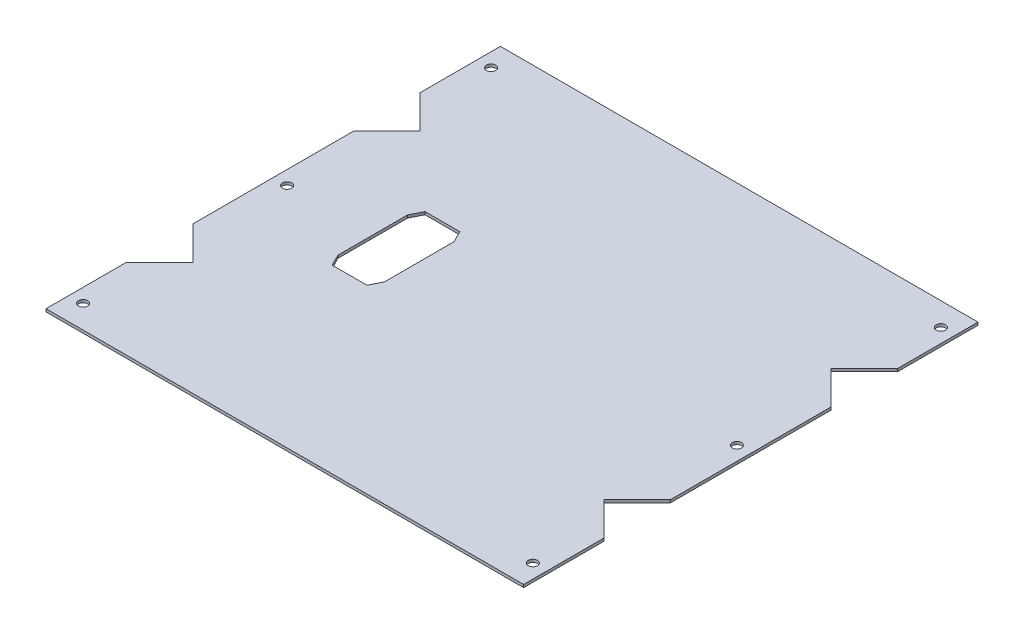
ISO-10303-21;
HEADER;
FILE_DESCRIPTION(('STEP AP214'),'2;1');
FILE_NAME('part.step','',(''),(''),'','','');
FILE_SCHEMA(('AUTOMOTIVE_DESIGN { 1 0 10303 214 1 1 1 1 }'));
ENDSEC;
DATA;
#1=APPLICATION_CONTEXT('core data for automotive mechanical design processes');
#2=APPLICATION_PROTOCOL_DEFINITION('international standard','automotive_design',2000,#1);
#3=PRODUCT_CONTEXT('',#1,'mechanical');
#4=PRODUCT('Part','Part','',(#3));
#5=PRODUCT_RELATED_PRODUCT_CATEGORY('part','',(#4));
#6=PRODUCT_DEFINITION_FORMATION('','',#4);
#7=PRODUCT_DEFINITION_CONTEXT('part definition',#1,'design');
#8=PRODUCT_DEFINITION('design','',#6,#7);
#9=PRODUCT_DEFINITION_SHAPE('','',#8);
#10=(LENGTH_UNIT() NAMED_UNIT(*) SI_UNIT(.MILLI.,.METRE.));
#11=(NAMED_UNIT(*) PLANE_ANGLE_UNIT() SI_UNIT($,.RADIAN.));
#12=(NAMED_UNIT(*) SI_UNIT($,.STERADIAN.) SOLID_ANGLE_UNIT());
#13=UNCERTAINTY_MEASURE_WITH_UNIT(LENGTH_MEASURE(1.E-05),#10,'distance_accuracy_value','');
#14=(GEOMETRIC_REPRESENTATION_CONTEXT(3) GLOBAL_UNCERTAINTY_ASSIGNED_CONTEXT((#13)) GLOBAL_UNIT_ASSIGNED_CONTEXT((#10,
#11,#12)) REPRESENTATION_CONTEXT('',''));
#15=CARTESIAN_POINT('',(0.,0.,0.));
#16=DIRECTION('',(0.,0.,1.));
#17=DIRECTION('',(1.,0.,0.));
#18=AXIS2_PLACEMENT_3D('',#15,#16,#17);
#19=CARTESIAN_POINT('',(0.,-1.2,0.));
#20=DIRECTION('',(0.,-1.,0.));
#21=DIRECTION('',(0.,0.,-1.));
#22=AXIS2_PLACEMENT_3D('',#19,#20,#21);
#23=PLANE('',#22);
#24=DIRECTION('',(0.707106781186546,0.,-0.707106781186549));
#25=VECTOR('',#24,1.);
#26=CARTESIAN_POINT('',(90.1247785636565,-1.20000000000003,47.4464466094067));
#27=LINE('',#26,#25);
#28=CARTESIAN_POINT('',(88.608835891235,-1.20000000000002,48.9623892818282));
#29=VERTEX_POINT('',#28);
#30=CARTESIAN_POINT('',(102.924778563656,-1.20000000000012,34.6464466094067));
#31=VERTEX_POINT('',#30);
#32=EDGE_CURVE('E827',#29,#31,#27,.T.);
#33=ORIENTED_EDGE('',*,*,#32,.F.);
#34=DIRECTION('',(-0.707106781186546,0.,-0.707106781186549));
#35=VECTOR('',#34,1.);
#36=CARTESIAN_POINT('',(124.884275797213,-1.20000000000044,85.2378291878067));
#37=LINE('',#36,#35);
#38=CARTESIAN_POINT('',(102.924778563656,-1.20000000000017,63.2783319542498));
#39=VERTEX_POINT('',#38);
#40=EDGE_CURVE('E740',#39,#29,#37,.T.);
#41=ORIENTED_EDGE('',*,*,#40,.F.);
#42=DIRECTION('',(0.,0.,1.));
#43=VECTOR('',#42,1.);
#44=CARTESIAN_POINT('',(102.924778563656,-1.2000000000004,97.9247785636565));
#45=LINE('',#44,#43);
#46=CARTESIAN_POINT('',(102.924778563656,-1.2000000000004,97.9247785636565));
#47=VERTEX_POINT('',#46);
#48=EDGE_CURVE('E756',#47,#39,#45,.F.);
#49=ORIENTED_EDGE('',*,*,#48,.F.);
#50=DIRECTION('',(-1.,0.,0.));
#51=VECTOR('',#50,1.);
#52=CARTESIAN_POINT('',(89.1247785636564,-1.20000000000031,97.9247785636565));
#53=LINE('',#52,#51);
#54=CARTESIAN_POINT('',(-102.924778563656,-1.2000000000004,97.9247785636565));
#55=VERTEX_POINT('',#54);
#56=EDGE_CURVE('E778',#55,#47,#53,.F.);
#57=ORIENTED_EDGE('',*,*,#56,.F.);
#58=DIRECTION('',(0.,0.,-1.));
#59=VECTOR('',#58,1.);
#60=CARTESIAN_POINT('',(-102.924778563656,-1.20000000000007,50.1247785636566));
#61=LINE('',#60,#59);
#62=CARTESIAN_POINT('',(-102.924778563656,-1.20000000000017,63.2783319542498));
#63=VERTEX_POINT('',#62);
#64=EDGE_CURVE('E769',#63,#55,#61,.F.);
#65=ORIENTED_EDGE('',*,*,#64,.F.);
#66=DIRECTION('',(-0.707106781186546,0.,0.707106781186549));
#67=VECTOR('',#66,1.);
#68=CARTESIAN_POINT('',(-90.1247785636564,-1.2,50.4783319542498));
#69=LINE('',#68,#67);
#70=CARTESIAN_POINT('',(-88.6088358912349,-1.19999999999998,48.9623892818283));
#71=VERTEX_POINT('',#70);
#72=EDGE_CURVE('E744',#71,#63,#69,.T.);
#73=ORIENTED_EDGE('',*,*,#72,.F.);
#74=DIRECTION('',(0.707106781186546,0.,0.707106781186549));
#75=VECTOR('',#74,1.);
#76=CARTESIAN_POINT('',(-157.837189477156,-1.20000000000045,-20.2659643040926));
#77=LINE('',#76,#75);
#78=CARTESIAN_POINT('',(-102.924778563656,-1.20000000000009,34.6464466094067));
#79=VERTEX_POINT('',#78);
#80=EDGE_CURVE('E860',#79,#71,#77,.T.);
#81=ORIENTED_EDGE('',*,*,#80,.F.);
#82=DIRECTION('',(0.,0.,-1.));
#83=VECTOR('',#82,1.);
#84=CARTESIAN_POINT('',(-102.924778563656,-1.2000000000001,-47.8));
#85=LINE('',#84,#83);
#86=CARTESIAN_POINT('',(-102.924778563656,-1.2000000000001,-34.6464466094066));
#87=VERTEX_POINT('',#86);
#88=EDGE_CURVE('E829',#87,#79,#85,.F.);
#89=ORIENTED_EDGE('',*,*,#88,.F.);
#90=DIRECTION('',(-0.707106781186545,0.,0.70710678118655));
#91=VECTOR('',#90,1.);
#92=CARTESIAN_POINT('',(-90.1247785636564,-1.20000000000001,-47.4464466094067));
#93=LINE('',#92,#91);
#94=CARTESIAN_POINT('',(-88.6088358912349,-1.20000000000001,-48.9623892818282));
#95=VERTEX_POINT('',#94);
#96=EDGE_CURVE('E711',#95,#87,#93,.T.);
#97=ORIENTED_EDGE('',*,*,#96,.F.);
#98=DIRECTION('',(0.707106781186545,0.,0.70710678118655));
#99=VECTOR('',#98,1.);
#100=CARTESIAN_POINT('',(-124.884275797213,-1.20000000000035,-85.2378291878066));
#101=LINE('',#100,#99);
#102=CARTESIAN_POINT('',(-102.924778563656,-1.20000000000015,-63.2783319542498));
#103=VERTEX_POINT('',#102);
#104=EDGE_CURVE('E727',#103,#95,#101,.T.);
#105=ORIENTED_EDGE('',*,*,#104,.F.);
#106=DIRECTION('',(0.,0.,-1.));
#107=VECTOR('',#106,1.);
#108=CARTESIAN_POINT('',(-102.924778563656,-1.20000000000027,-97.9247785636564));
#109=LINE('',#108,#107);
#110=CARTESIAN_POINT('',(-102.924778563656,-1.20000000000027,-97.9247785636564));
#111=VERTEX_POINT('',#110);
#112=EDGE_CURVE('E799',#111,#103,#109,.F.);
#113=ORIENTED_EDGE('',*,*,#112,.F.);
#114=DIRECTION('',(-1.,0.,0.));
#115=VECTOR('',#114,1.);
#116=CARTESIAN_POINT('',(89.1247785636564,-1.2000000000002,-97.9247785636564));
#117=LINE('',#116,#115);
#118=CARTESIAN_POINT('',(102.924778563656,-1.20000000000028,-97.9247785636564));
#119=VERTEX_POINT('',#118);
#120=EDGE_CURVE('E743',#119,#111,#117,.T.);
#121=ORIENTED_EDGE('',*,*,#120,.F.);
#122=DIRECTION('',(0.,0.,-1.));
#123=VECTOR('',#122,1.);
#124=CARTESIAN_POINT('',(102.924778563656,-1.20000000000028,-97.9247785636564));
#125=LINE('',#124,#123);
#126=CARTESIAN_POINT('',(102.924778563656,-1.20000000000016,-63.2783319542498));
#127=VERTEX_POINT('',#126);
#128=EDGE_CURVE('E812',#127,#119,#125,.T.);
#129=ORIENTED_EDGE('',*,*,#128,.F.);
#130=DIRECTION('',(0.707106781186545,0.,-0.70710678118655));
#131=VECTOR('',#130,1.);
#132=CARTESIAN_POINT('',(90.1247785636564,-1.20000000000005,-50.4783319542497));
#133=LINE('',#132,#131);
#134=CARTESIAN_POINT('',(88.608835891235,-1.20000000000003,-48.9623892818282));
#135=VERTEX_POINT('',#134);
#136=EDGE_CURVE('E790',#135,#127,#133,.T.);
#137=ORIENTED_EDGE('',*,*,#136,.F.);
#138=DIRECTION('',(-0.707106781186545,0.,-0.70710678118655));
#139=VECTOR('',#138,1.);
#140=CARTESIAN_POINT('',(157.837189477155,-1.20000000000055,20.2659643040927));
#141=LINE('',#140,#139);
#142=CARTESIAN_POINT('',(102.924778563656,-1.2000000000001,-34.6464466094066));
#143=VERTEX_POINT('',#142);
#144=EDGE_CURVE('E839',#143,#135,#141,.T.);
#145=ORIENTED_EDGE('',*,*,#144,.F.);
#146=DIRECTION('',(0.,0.,1.));
#147=VECTOR('',#146,1.);
#148=CARTESIAN_POINT('',(102.924778563656,-1.20000000000012,47.8));
#149=LINE('',#148,#147);
#150=EDGE_CURVE('E789',#31,#143,#149,.F.);
#151=ORIENTED_EDGE('',*,*,#150,.F.);
#152=EDGE_LOOP('',(#33,#41,#49,#57,#65,#73,#81,#89,#97,#105,#113,#121,#129,#137,#145,#151));
#153=FACE_BOUND('',#152,.T.);
#154=DIRECTION('',(-0.447213595499959,0.,-0.894427190999915));
#155=VECTOR('',#154,1.);
#156=CARTESIAN_POINT('',(-60.,-1.2,15.));
#157=LINE('',#156,#155);
#158=CARTESIAN_POINT('',(-57.5,-1.2,20.));
#159=VERTEX_POINT('',#158);
#160=CARTESIAN_POINT('',(-60.,-1.2,15.));
#161=VERTEX_POINT('',#160);
#162=EDGE_CURVE('E554',#159,#161,#157,.T.);
#163=ORIENTED_EDGE('',*,*,#162,.F.);
#164=DIRECTION('',(-1.,0.,0.));
#165=VECTOR('',#164,1.);
#166=CARTESIAN_POINT('',(-57.5,-1.2,20.));
#167=LINE('',#166,#165);
#168=CARTESIAN_POINT('',(-42.5,-1.2,20.));
#169=VERTEX_POINT('',#168);
#170=EDGE_CURVE('E892',#169,#159,#167,.T.);
#171=ORIENTED_EDGE('',*,*,#170,.F.);
#172=DIRECTION('',(-0.447213595499957,0.,0.894427190999916));
#173=VECTOR('',#172,1.);
#174=CARTESIAN_POINT('',(-42.5,-1.2,20.));
#175=LINE('',#174,#173);
#176=CARTESIAN_POINT('',(-40.,-1.2,15.));
#177=VERTEX_POINT('',#176);
#178=EDGE_CURVE('E889',#177,#169,#175,.T.);
#179=ORIENTED_EDGE('',*,*,#178,.F.);
#180=DIRECTION('',(0.,0.,1.));
#181=VECTOR('',#180,1.);
#182=CARTESIAN_POINT('',(-40.,-1.2,15.));
#183=LINE('',#182,#181);
#184=CARTESIAN_POINT('',(-40.,-1.2,-15.));
#185=VERTEX_POINT('',#184);
#186=EDGE_CURVE('E886',#185,#177,#183,.T.);
#187=ORIENTED_EDGE('',*,*,#186,.F.);
#188=DIRECTION('',(0.447213595499959,0.,0.894427190999915));
#189=VECTOR('',#188,1.);
#190=CARTESIAN_POINT('',(-42.5,-1.2,-20.));
#191=LINE('',#190,#189);
#192=CARTESIAN_POINT('',(-42.5,-1.2,-20.));
#193=VERTEX_POINT('',#192);
#194=EDGE_CURVE('E883',#193,#185,#191,.T.);
#195=ORIENTED_EDGE('',*,*,#194,.F.);
#196=DIRECTION('',(1.,0.,0.));
#197=VECTOR('',#196,1.);
#198=CARTESIAN_POINT('',(-57.5,-1.2,-20.));
#199=LINE('',#198,#197);
#200=CARTESIAN_POINT('',(-57.5,-1.2,-20.));
#201=VERTEX_POINT('',#200);
#202=EDGE_CURVE('E880',#201,#193,#199,.T.);
#203=ORIENTED_EDGE('',*,*,#202,.F.);
#204=DIRECTION('',(0.447213595499959,0.,-0.894427190999915));
#205=VECTOR('',#204,1.);
#206=CARTESIAN_POINT('',(-60.,-1.2,-15.));
#207=LINE('',#206,#205);
#208=CARTESIAN_POINT('',(-60.,-1.2,-15.));
#209=VERTEX_POINT('',#208);
#210=EDGE_CURVE('E877',#209,#201,#207,.T.);
#211=ORIENTED_EDGE('',*,*,#210,.F.);
#212=DIRECTION('',(0.,0.,-1.));
#213=VECTOR('',#212,1.);
#214=CARTESIAN_POINT('',(-60.,-1.2,15.));
#215=LINE('',#214,#213);
#216=EDGE_CURVE('E875',#161,#209,#215,.T.);
#217=ORIENTED_EDGE('',*,*,#216,.F.);
#218=EDGE_LOOP('',(#163,#171,#179,#187,#195,#203,#211,#217));
#219=FACE_BOUND('',#218,.T.);
#220=CARTESIAN_POINT('',(-96.9247785636565,-1.20000000000006,1.42887684773479E-13));
#221=DIRECTION('',(0.,-1.,0.));
#222=DIRECTION('',(1.,0.,0.));
#223=AXIS2_PLACEMENT_3D('',#220,#221,#222);
#224=CIRCLE('',#223,2.);
#225=CARTESIAN_POINT('',(-94.9247785636565,-1.20000000000005,1.43321365642473E-13));
#226=VERTEX_POINT('',#225);
#227=EDGE_CURVE('E863',#226,#226,#224,.T.);
#228=ORIENTED_EDGE('',*,*,#227,.F.);
#229=EDGE_LOOP('',(#228));
#230=FACE_BOUND('',#229,.T.);
#231=CARTESIAN_POINT('',(96.924778563657,-1.20000000000026,0.));
#232=DIRECTION('',(0.,1.,0.));
#233=DIRECTION('',(-1.,0.,0.));
#234=AXIS2_PLACEMENT_3D('',#231,#232,#233);
#235=CIRCLE('',#234,2.);
#236=CARTESIAN_POINT('',(94.924778563657,-1.20000000000026,0.));
#237=VERTEX_POINT('',#236);
#238=EDGE_CURVE('E842',#237,#237,#235,.T.);
#239=ORIENTED_EDGE('',*,*,#238,.T.);
#240=EDGE_LOOP('',(#239));
#241=FACE_BOUND('',#240,.T.);
#242=CARTESIAN_POINT('',(-96.9247785636563,-1.20000000000029,-87.9247785636565));
#243=DIRECTION('',(0.,-1.,0.));
#244=DIRECTION('',(0.,0.,-1.));
#245=AXIS2_PLACEMENT_3D('',#242,#243,#244);
#246=CIRCLE('',#245,2.00000000000001);
#247=CARTESIAN_POINT('',(-96.9247785636563,-1.2000000000003,-89.9247785636565));
#248=VERTEX_POINT('',#247);
#249=EDGE_CURVE('E817',#248,#248,#246,.T.);
#250=ORIENTED_EDGE('',*,*,#249,.F.);
#251=EDGE_LOOP('',(#250));
#252=FACE_BOUND('',#251,.T.);
#253=CARTESIAN_POINT('',(96.9247785636563,-1.20000000000031,-87.9247785636571));
#254=DIRECTION('',(0.,1.,0.));
#255=DIRECTION('',(0.,0.,-1.));
#256=AXIS2_PLACEMENT_3D('',#253,#254,#255);
#257=CIRCLE('',#256,2.00000000000001);
#258=CARTESIAN_POINT('',(96.9247785636563,-1.20000000000031,-89.9247785636571));
#259=VERTEX_POINT('',#258);
#260=EDGE_CURVE('E723',#259,#259,#257,.T.);
#261=ORIENTED_EDGE('',*,*,#260,.T.);
#262=EDGE_LOOP('',(#261));
#263=FACE_BOUND('',#262,.T.);
#264=CARTESIAN_POINT('',(-96.9247785636564,-1.20000000000042,87.9247785636565));
#265=DIRECTION('',(0.,-1.,0.));
#266=DIRECTION('',(0.,0.,-1.));
#267=AXIS2_PLACEMENT_3D('',#264,#265,#266);
#268=CIRCLE('',#267,2.);
#269=CARTESIAN_POINT('',(-96.9247785636564,-1.2000000000004,85.9247785636565));
#270=VERTEX_POINT('',#269);
#271=EDGE_CURVE('E780',#270,#270,#268,.T.);
#272=ORIENTED_EDGE('',*,*,#271,.F.);
#273=EDGE_LOOP('',(#272));
#274=FACE_BOUND('',#273,.T.);
#275=CARTESIAN_POINT('',(96.9247785636565,-1.20000000000043,87.9247785636571));
#276=DIRECTION('',(0.,1.,0.));
#277=DIRECTION('',(0.,0.,-1.));
#278=AXIS2_PLACEMENT_3D('',#275,#276,#277);
#279=CIRCLE('',#278,2.);
#280=CARTESIAN_POINT('',(96.9247785636565,-1.20000000000042,85.9247785636571));
#281=VERTEX_POINT('',#280);
#282=EDGE_CURVE('E746',#281,#281,#279,.T.);
#283=ORIENTED_EDGE('',*,*,#282,.T.);
#284=EDGE_LOOP('',(#283));
#285=FACE_BOUND('',#284,.T.);
#286=ADVANCED_FACE('F539',(#153,#219,#230,#241,#252,#263,#274,#285),#23,.T.);
#287=CARTESIAN_POINT('',(0.,0.,0.));
#288=DIRECTION('',(0.,-1.,0.));
#289=DIRECTION('',(0.,0.,-1.));
#290=AXIS2_PLACEMENT_3D('',#287,#288,#289);
#291=PLANE('',#290);
#292=DIRECTION('',(-0.707106781186546,0.,-0.707106781186549));
#293=VECTOR('',#292,1.);
#294=CARTESIAN_POINT('',(113.34800186836,-2.98372437868011E-13,73.7015552589529));
#295=LINE('',#294,#293);
#296=CARTESIAN_POINT('',(102.924778563656,-1.66533453693773E-13,63.2783319542498));
#297=VERTEX_POINT('',#296);
#298=CARTESIAN_POINT('',(88.608835891235,0.,48.9623892818282));
#299=VERTEX_POINT('',#298);
#300=EDGE_CURVE('E749',#297,#299,#295,.T.);
#301=ORIENTED_EDGE('',*,*,#300,.T.);
#302=DIRECTION('',(0.707106781186546,0.,-0.707106781186549));
#303=VECTOR('',#302,1.);
#304=CARTESIAN_POINT('',(113.34800186836,-1.66533453693773E-13,24.2232233047034));
#305=LINE('',#304,#303);
#306=CARTESIAN_POINT('',(102.924778563656,0.,34.6464466094067));
#307=VERTEX_POINT('',#306);
#308=EDGE_CURVE('E830',#299,#307,#305,.T.);
#309=ORIENTED_EDGE('',*,*,#308,.T.);
#310=DIRECTION('',(0.,0.,-1.));
#311=VECTOR('',#310,1.);
#312=CARTESIAN_POINT('',(102.924778563656,0.,0.));
#313=LINE('',#312,#311);
#314=CARTESIAN_POINT('',(102.924778563656,0.,-34.6464466094066));
#315=VERTEX_POINT('',#314);
#316=EDGE_CURVE('E836',#307,#315,#313,.T.);
#317=ORIENTED_EDGE('',*,*,#316,.T.);
#318=DIRECTION('',(-0.707106781186545,0.,-0.70710678118655));
#319=VECTOR('',#318,1.);
#320=CARTESIAN_POINT('',(113.34800186836,-1.80411241501588E-13,-24.2232233047033));
#321=LINE('',#320,#319);
#322=CARTESIAN_POINT('',(88.608835891235,0.,-48.9623892818282));
#323=VERTEX_POINT('',#322);
#324=EDGE_CURVE('E833',#315,#323,#321,.T.);
#325=ORIENTED_EDGE('',*,*,#324,.T.);
#326=DIRECTION('',(-0.707106781186545,0.,0.70710678118655));
#327=VECTOR('',#326,1.);
#328=CARTESIAN_POINT('',(113.34800186836,-2.70616862252382E-13,-73.701555258953));
#329=LINE('',#328,#327);
#330=CARTESIAN_POINT('',(102.924778563656,-1.52655665885959E-13,-63.2783319542498));
#331=VERTEX_POINT('',#330);
#332=EDGE_CURVE('E792',#331,#323,#329,.T.);
#333=ORIENTED_EDGE('',*,*,#332,.F.);
#334=DIRECTION('',(0.,0.,1.));
#335=VECTOR('',#334,1.);
#336=CARTESIAN_POINT('',(102.924778563656,-1.04083408558608E-13,-49.1247785636564));
#337=LINE('',#336,#335);
#338=CARTESIAN_POINT('',(102.924778563656,-2.77555756156289E-13,-97.9247785636564));
#339=VERTEX_POINT('',#338);
#340=EDGE_CURVE('E804',#331,#339,#337,.F.);
#341=ORIENTED_EDGE('',*,*,#340,.T.);
#342=DIRECTION('',(1.,0.,0.));
#343=VECTOR('',#342,1.);
#344=CARTESIAN_POINT('',(137.924778563656,-5.13478148889135E-13,-97.9247785636564));
#345=LINE('',#344,#343);
#346=CARTESIAN_POINT('',(-102.924778563656,-2.63677968348475E-13,-97.9247785636564));
#347=VERTEX_POINT('',#346);
#348=EDGE_CURVE('E802',#339,#347,#345,.F.);
#349=ORIENTED_EDGE('',*,*,#348,.T.);
#350=DIRECTION('',(0.,0.,1.));
#351=VECTOR('',#350,1.);
#352=CARTESIAN_POINT('',(-102.924778563656,0.,-49.1247785636564));
#353=LINE('',#352,#351);
#354=CARTESIAN_POINT('',(-102.924778563656,-1.38777878078145E-13,-63.2783319542498));
#355=VERTEX_POINT('',#354);
#356=EDGE_CURVE('E720',#347,#355,#353,.T.);
#357=ORIENTED_EDGE('',*,*,#356,.T.);
#358=DIRECTION('',(0.707106781186545,0.,0.70710678118655));
#359=VECTOR('',#358,1.);
#360=CARTESIAN_POINT('',(-113.348001868359,-2.56739074444567E-13,-73.701555258953));
#361=LINE('',#360,#359);
#362=CARTESIAN_POINT('',(-88.6088358912349,0.,-48.9623892818282));
#363=VERTEX_POINT('',#362);
#364=EDGE_CURVE('E716',#355,#363,#361,.T.);
#365=ORIENTED_EDGE('',*,*,#364,.T.);
#366=DIRECTION('',(-0.707106781186545,0.,0.70710678118655));
#367=VECTOR('',#366,1.);
#368=CARTESIAN_POINT('',(-113.34800186836,-1.66533453693773E-13,-24.2232233047033));
#369=LINE('',#368,#367);
#370=CARTESIAN_POINT('',(-102.924778563656,0.,-34.6464466094066));
#371=VERTEX_POINT('',#370);
#372=EDGE_CURVE('E701',#363,#371,#369,.T.);
#373=ORIENTED_EDGE('',*,*,#372,.T.);
#374=DIRECTION('',(0.,0.,1.));
#375=VECTOR('',#374,1.);
#376=CARTESIAN_POINT('',(-102.924778563656,0.,0.));
#377=LINE('',#376,#375);
#378=CARTESIAN_POINT('',(-102.924778563656,0.,34.6464466094067));
#379=VERTEX_POINT('',#378);
#380=EDGE_CURVE('E858',#371,#379,#377,.T.);
#381=ORIENTED_EDGE('',*,*,#380,.T.);
#382=DIRECTION('',(0.707106781186546,0.,0.707106781186549));
#383=VECTOR('',#382,1.);
#384=CARTESIAN_POINT('',(-113.34800186836,-1.52655665885959E-13,24.2232233047034));
#385=LINE('',#384,#383);
#386=CARTESIAN_POINT('',(-88.6088358912349,0.,48.9623892818283));
#387=VERTEX_POINT('',#386);
#388=EDGE_CURVE('E712',#379,#387,#385,.T.);
#389=ORIENTED_EDGE('',*,*,#388,.T.);
#390=DIRECTION('',(-0.707106781186546,0.,0.707106781186549));
#391=VECTOR('',#390,1.);
#392=CARTESIAN_POINT('',(-113.34800186836,-3.05311331771918E-13,73.7015552589529));
#393=LINE('',#392,#391);
#394=CARTESIAN_POINT('',(-102.924778563656,-1.59594559789866E-13,63.2783319542498));
#395=VERTEX_POINT('',#394);
#396=EDGE_CURVE('E763',#387,#395,#393,.T.);
#397=ORIENTED_EDGE('',*,*,#396,.T.);
#398=DIRECTION('',(0.,0.,1.));
#399=VECTOR('',#398,1.);
#400=CARTESIAN_POINT('',(-102.924778563656,0.,49.1247785636563));
#401=LINE('',#400,#399);
#402=CARTESIAN_POINT('',(-102.924778563656,-3.95516952522712E-13,97.9247785636565));
#403=VERTEX_POINT('',#402);
#404=EDGE_CURVE('E761',#395,#403,#401,.T.);
#405=ORIENTED_EDGE('',*,*,#404,.T.);
#406=DIRECTION('',(1.,0.,0.));
#407=VECTOR('',#406,1.);
#408=CARTESIAN_POINT('',(-137.924778563656,-6.31439345255558E-13,97.9247785636565));
#409=LINE('',#408,#407);
#410=CARTESIAN_POINT('',(102.924778563656,-3.88578058618805E-13,97.9247785636565));
#411=VERTEX_POINT('',#410);
#412=EDGE_CURVE('E759',#403,#411,#409,.T.);
#413=ORIENTED_EDGE('',*,*,#412,.T.);
#414=DIRECTION('',(0.,0.,-1.));
#415=VECTOR('',#414,1.);
#416=CARTESIAN_POINT('',(102.924778563656,0.,49.1247785636563));
#417=LINE('',#416,#415);
#418=EDGE_CURVE('E751',#411,#297,#417,.T.);
#419=ORIENTED_EDGE('',*,*,#418,.T.);
#420=EDGE_LOOP('',(#301,#309,#317,#325,#333,#341,#349,#357,#365,#373,#381,#389,#397,#405,#413,#419));
#421=FACE_BOUND('',#420,.T.);
#422=DIRECTION('',(-1.,0.,0.));
#423=VECTOR('',#422,1.);
#424=CARTESIAN_POINT('',(0.,0.,20.));
#425=LINE('',#424,#423);
#426=CARTESIAN_POINT('',(-42.5,0.,20.));
#427=VERTEX_POINT('',#426);
#428=CARTESIAN_POINT('',(-57.5,0.,20.));
#429=VERTEX_POINT('',#428);
#430=EDGE_CURVE('E547',#427,#429,#425,.T.);
#431=ORIENTED_EDGE('',*,*,#430,.T.);
#432=DIRECTION('',(-0.447213595499959,0.,-0.894427190999915));
#433=VECTOR('',#432,1.);
#434=CARTESIAN_POINT('',(-53.9999999999999,0.,27.0000000000001));
#435=LINE('',#434,#433);
#436=CARTESIAN_POINT('',(-60.,0.,15.));
#437=VERTEX_POINT('',#436);
#438=EDGE_CURVE('E13',#429,#437,#435,.T.);
#439=ORIENTED_EDGE('',*,*,#438,.T.);
#440=DIRECTION('',(0.,0.,-1.));
#441=VECTOR('',#440,1.);
#442=CARTESIAN_POINT('',(-60.,0.,0.));
#443=LINE('',#442,#441);
#444=CARTESIAN_POINT('',(-60.,0.,-15.));
#445=VERTEX_POINT('',#444);
#446=EDGE_CURVE('E898',#437,#445,#443,.T.);
#447=ORIENTED_EDGE('',*,*,#446,.T.);
#448=DIRECTION('',(0.447213595499959,0.,-0.894427190999915));
#449=VECTOR('',#448,1.);
#450=CARTESIAN_POINT('',(-53.9999999999999,0.,-27.0000000000001));
#451=LINE('',#450,#449);
#452=CARTESIAN_POINT('',(-57.5,0.,-20.));
#453=VERTEX_POINT('',#452);
#454=EDGE_CURVE('E913',#445,#453,#451,.T.);
#455=ORIENTED_EDGE('',*,*,#454,.T.);
#456=DIRECTION('',(1.,0.,0.));
#457=VECTOR('',#456,1.);
#458=CARTESIAN_POINT('',(0.,0.,-20.));
#459=LINE('',#458,#457);
#460=CARTESIAN_POINT('',(-42.5,0.,-20.));
#461=VERTEX_POINT('',#460);
#462=EDGE_CURVE('E916',#453,#461,#459,.T.);
#463=ORIENTED_EDGE('',*,*,#462,.T.);
#464=DIRECTION('',(0.447213595499959,0.,0.894427190999915));
#465=VECTOR('',#464,1.);
#466=CARTESIAN_POINT('',(-25.9999999999999,0.,13.));
#467=LINE('',#466,#465);
#468=CARTESIAN_POINT('',(-40.,0.,-15.));
#469=VERTEX_POINT('',#468);
#470=EDGE_CURVE('E919',#461,#469,#467,.T.);
#471=ORIENTED_EDGE('',*,*,#470,.T.);
#472=DIRECTION('',(0.,0.,1.));
#473=VECTOR('',#472,1.);
#474=CARTESIAN_POINT('',(-40.,0.,0.));
#475=LINE('',#474,#473);
#476=CARTESIAN_POINT('',(-40.,0.,15.));
#477=VERTEX_POINT('',#476);
#478=EDGE_CURVE('E922',#469,#477,#475,.T.);
#479=ORIENTED_EDGE('',*,*,#478,.T.);
#480=DIRECTION('',(-0.447213595499957,0.,0.894427190999916));
#481=VECTOR('',#480,1.);
#482=CARTESIAN_POINT('',(-26.,0.,-13.));
#483=LINE('',#482,#481);
#484=EDGE_CURVE('E925',#477,#427,#483,.T.);
#485=ORIENTED_EDGE('',*,*,#484,.T.);
#486=EDGE_LOOP('',(#431,#439,#447,#455,#463,#471,#479,#485));
#487=FACE_BOUND('',#486,.T.);
#488=CARTESIAN_POINT('',(-96.9247785636565,0.,1.42799496948236E-13));
#489=DIRECTION('',(0.,1.,0.));
#490=DIRECTION('',(-1.,0.,0.));
#491=AXIS2_PLACEMENT_3D('',#488,#489,#490);
#492=CIRCLE('',#491,2.);
#493=CARTESIAN_POINT('',(-98.9247785636565,0.,1.42365816079242E-13));
#494=VERTEX_POINT('',#493);
#495=EDGE_CURVE('E866',#494,#494,#492,.T.);
#496=ORIENTED_EDGE('',*,*,#495,.F.);
#497=EDGE_LOOP('',(#496));
#498=FACE_BOUND('',#497,.T.);
#499=CARTESIAN_POINT('',(96.924778563657,0.,0.));
#500=DIRECTION('',(0.,1.,0.));
#501=DIRECTION('',(-1.,0.,0.));
#502=AXIS2_PLACEMENT_3D('',#499,#500,#501);
#503=CIRCLE('',#502,2.);
#504=CARTESIAN_POINT('',(94.924778563657,0.,0.));
#505=VERTEX_POINT('',#504);
#506=EDGE_CURVE('E845',#505,#505,#503,.T.);
#507=ORIENTED_EDGE('',*,*,#506,.F.);
#508=EDGE_LOOP('',(#507));
#509=FACE_BOUND('',#508,.T.);
#510=CARTESIAN_POINT('',(-96.9247785636563,-2.0122792321331E-13,-87.9247785636565));
#511=DIRECTION('',(0.,1.,0.));
#512=DIRECTION('',(1.,0.,0.));
#513=AXIS2_PLACEMENT_3D('',#510,#511,#512);
#514=CIRCLE('',#513,2.00000000000001);
#515=CARTESIAN_POINT('',(-94.9247785636563,-1.88211139749617E-13,-87.9247785636565));
#516=VERTEX_POINT('',#515);
#517=EDGE_CURVE('E820',#516,#516,#514,.T.);
#518=ORIENTED_EDGE('',*,*,#517,.F.);
#519=EDGE_LOOP('',(#518));
#520=FACE_BOUND('',#519,.T.);
#521=CARTESIAN_POINT('',(96.9247785636563,-2.15105711021124E-13,-87.9247785636571));
#522=DIRECTION('',(0.,-1.,0.));
#523=DIRECTION('',(-1.,0.,0.));
#524=AXIS2_PLACEMENT_3D('',#521,#522,#523);
#525=CIRCLE('',#524,2.00000000000001);
#526=CARTESIAN_POINT('',(94.9247785636563,-2.02088927557431E-13,-87.9247785636571));
#527=VERTEX_POINT('',#526);
#528=EDGE_CURVE('E806',#527,#527,#525,.T.);
#529=ORIENTED_EDGE('',*,*,#528,.T.);
#530=EDGE_LOOP('',(#529));
#531=FACE_BOUND('',#530,.T.);
#532=CARTESIAN_POINT('',(96.9247785636565,-2.98372437868011E-13,87.9247785636571));
#533=DIRECTION('',(0.,1.,0.));
#534=DIRECTION('',(-1.,0.,0.));
#535=AXIS2_PLACEMENT_3D('',#532,#533,#534);
#536=CIRCLE('',#535,2.);
#537=CARTESIAN_POINT('',(94.9247785636565,-2.85355654404318E-13,87.9247785636571));
#538=VERTEX_POINT('',#537);
#539=EDGE_CURVE('E739',#538,#538,#536,.T.);
#540=ORIENTED_EDGE('',*,*,#539,.F.);
#541=EDGE_LOOP('',(#540));
#542=FACE_BOUND('',#541,.T.);
#543=CARTESIAN_POINT('',(-96.9247785636564,-3.33066907387547E-13,87.9247785636566));
#544=DIRECTION('',(0.,1.,0.));
#545=DIRECTION('',(-1.,0.,0.));
#546=AXIS2_PLACEMENT_3D('',#543,#544,#545);
#547=CIRCLE('',#546,2.);
#548=CARTESIAN_POINT('',(-98.9247785636564,-3.46083690851239E-13,87.9247785636565));
#549=VERTEX_POINT('',#548);
#550=EDGE_CURVE('E783',#549,#549,#547,.T.);
#551=ORIENTED_EDGE('',*,*,#550,.F.);
#552=EDGE_LOOP('',(#551));
#553=FACE_BOUND('',#552,.T.);
#554=ADVANCED_FACE('F541',(#421,#487,#498,#509,#520,#531,#542,#553),#291,.F.);
#555=CARTESIAN_POINT('',(-60.,8.8,15.));
#556=DIRECTION('',(-0.894427190999915,0.,0.447213595499959));
#557=DIRECTION('',(0.447213595499959,0.,0.894427190999915));
#558=AXIS2_PLACEMENT_3D('',#555,#556,#557);
#559=PLANE('',#558);
#560=DIRECTION('',(0.,-1.,0.));
#561=VECTOR('',#560,1.);
#562=CARTESIAN_POINT('',(-57.5,8.8,20.));
#563=LINE('',#562,#561);
#564=EDGE_CURVE('E896',#429,#159,#563,.T.);
#565=ORIENTED_EDGE('',*,*,#564,.T.);
#566=ORIENTED_EDGE('',*,*,#162,.T.);
#567=DIRECTION('',(0.,-1.,0.));
#568=VECTOR('',#567,1.);
#569=CARTESIAN_POINT('',(-60.,8.8,15.));
#570=LINE('',#569,#568);
#571=EDGE_CURVE('E895',#437,#161,#570,.T.);
#572=ORIENTED_EDGE('',*,*,#571,.F.);
#573=ORIENTED_EDGE('',*,*,#438,.F.);
#574=EDGE_LOOP('',(#565,#566,#572,#573));
#575=FACE_BOUND('',#574,.T.);
#576=ADVANCED_FACE('F945',(#575),#559,.F.);
#577=CARTESIAN_POINT('',(-57.5,8.8,20.));
#578=DIRECTION('',(0.,0.,1.));
#579=DIRECTION('',(1.,0.,0.));
#580=AXIS2_PLACEMENT_3D('',#577,#578,#579);
#581=PLANE('',#580);
#582=DIRECTION('',(0.,-1.,0.));
#583=VECTOR('',#582,1.);
#584=CARTESIAN_POINT('',(-42.5,8.8,20.));
#585=LINE('',#584,#583);
#586=EDGE_CURVE('E899',#427,#169,#585,.T.);
#587=ORIENTED_EDGE('',*,*,#586,.T.);
#588=ORIENTED_EDGE('',*,*,#170,.T.);
#589=ORIENTED_EDGE('',*,*,#564,.F.);
#590=ORIENTED_EDGE('',*,*,#430,.F.);
#591=EDGE_LOOP('',(#587,#588,#589,#590));
#592=FACE_BOUND('',#591,.T.);
#593=ADVANCED_FACE('F932',(#592),#581,.F.);
#594=CARTESIAN_POINT('',(-42.5,8.8,20.));
#595=DIRECTION('',(0.894427190999916,0.,0.447213595499957));
#596=DIRECTION('',(0.447213595499957,0.,-0.894427190999916));
#597=AXIS2_PLACEMENT_3D('',#594,#595,#596);
#598=PLANE('',#597);
#599=DIRECTION('',(0.,-1.,0.));
#600=VECTOR('',#599,1.);
#601=CARTESIAN_POINT('',(-40.,8.8,15.));
#602=LINE('',#601,#600);
#603=EDGE_CURVE('E901',#477,#177,#602,.T.);
#604=ORIENTED_EDGE('',*,*,#603,.T.);
#605=ORIENTED_EDGE('',*,*,#178,.T.);
#606=ORIENTED_EDGE('',*,*,#586,.F.);
#607=ORIENTED_EDGE('',*,*,#484,.F.);
#608=EDGE_LOOP('',(#604,#605,#606,#607));
#609=FACE_BOUND('',#608,.T.);
#610=ADVANCED_FACE('F934',(#609),#598,.F.);
#611=CARTESIAN_POINT('',(-40.,8.8,15.));
#612=DIRECTION('',(1.,0.,0.));
#613=DIRECTION('',(0.,0.,-1.));
#614=AXIS2_PLACEMENT_3D('',#611,#612,#613);
#615=PLANE('',#614);
#616=DIRECTION('',(0.,-1.,0.));
#617=VECTOR('',#616,1.);
#618=CARTESIAN_POINT('',(-40.,8.8,-15.));
#619=LINE('',#618,#617);
#620=EDGE_CURVE('E903',#469,#185,#619,.T.);
#621=ORIENTED_EDGE('',*,*,#620,.T.);
#622=ORIENTED_EDGE('',*,*,#186,.T.);
#623=ORIENTED_EDGE('',*,*,#603,.F.);
#624=ORIENTED_EDGE('',*,*,#478,.F.);
#625=EDGE_LOOP('',(#621,#622,#623,#624));
#626=FACE_BOUND('',#625,.T.);
#627=ADVANCED_FACE('F1057',(#626),#615,.F.);
#628=CARTESIAN_POINT('',(-42.5,8.8,-20.));
#629=DIRECTION('',(0.894427190999915,0.,-0.447213595499959));
#630=DIRECTION('',(-0.447213595499959,0.,-0.894427190999915));
#631=AXIS2_PLACEMENT_3D('',#628,#629,#630);
#632=PLANE('',#631);
#633=DIRECTION('',(0.,-1.,0.));
#634=VECTOR('',#633,1.);
#635=CARTESIAN_POINT('',(-42.5,8.8,-20.));
#636=LINE('',#635,#634);
#637=EDGE_CURVE('E905',#461,#193,#636,.T.);
#638=ORIENTED_EDGE('',*,*,#637,.T.);
#639=ORIENTED_EDGE('',*,*,#194,.T.);
#640=ORIENTED_EDGE('',*,*,#620,.F.);
#641=ORIENTED_EDGE('',*,*,#470,.F.);
#642=EDGE_LOOP('',(#638,#639,#640,#641));
#643=FACE_BOUND('',#642,.T.);
#644=ADVANCED_FACE('F1060',(#643),#632,.F.);
#645=CARTESIAN_POINT('',(-57.5,8.8,-20.));
#646=DIRECTION('',(0.,0.,-1.));
#647=DIRECTION('',(-1.,0.,0.));
#648=AXIS2_PLACEMENT_3D('',#645,#646,#647);
#649=PLANE('',#648);
#650=DIRECTION('',(0.,-1.,0.));
#651=VECTOR('',#650,1.);
#652=CARTESIAN_POINT('',(-57.5,8.8,-20.));
#653=LINE('',#652,#651);
#654=EDGE_CURVE('E907',#453,#201,#653,.T.);
#655=ORIENTED_EDGE('',*,*,#654,.T.);
#656=ORIENTED_EDGE('',*,*,#202,.T.);
#657=ORIENTED_EDGE('',*,*,#637,.F.);
#658=ORIENTED_EDGE('',*,*,#462,.F.);
#659=EDGE_LOOP('',(#655,#656,#657,#658));
#660=FACE_BOUND('',#659,.T.);
#661=ADVANCED_FACE('F1064',(#660),#649,.F.);
#662=CARTESIAN_POINT('',(-60.,8.8,-15.));
#663=DIRECTION('',(-0.894427190999915,0.,-0.447213595499959));
#664=DIRECTION('',(-0.447213595499959,0.,0.894427190999915));
#665=AXIS2_PLACEMENT_3D('',#662,#663,#664);
#666=PLANE('',#665);
#667=DIRECTION('',(0.,-1.,0.));
#668=VECTOR('',#667,1.);
#669=CARTESIAN_POINT('',(-60.,8.8,-15.));
#670=LINE('',#669,#668);
#671=EDGE_CURVE('E562',#445,#209,#670,.T.);
#672=ORIENTED_EDGE('',*,*,#671,.T.);
#673=ORIENTED_EDGE('',*,*,#210,.T.);
#674=ORIENTED_EDGE('',*,*,#654,.F.);
#675=ORIENTED_EDGE('',*,*,#454,.F.);
#676=EDGE_LOOP('',(#672,#673,#674,#675));
#677=FACE_BOUND('',#676,.T.);
#678=ADVANCED_FACE('F1068',(#677),#666,.F.);
#679=CARTESIAN_POINT('',(-60.,8.8,15.));
#680=DIRECTION('',(-1.,0.,0.));
#681=DIRECTION('',(0.,0.,1.));
#682=AXIS2_PLACEMENT_3D('',#679,#680,#681);
#683=PLANE('',#682);
#684=ORIENTED_EDGE('',*,*,#571,.T.);
#685=ORIENTED_EDGE('',*,*,#216,.T.);
#686=ORIENTED_EDGE('',*,*,#671,.F.);
#687=ORIENTED_EDGE('',*,*,#446,.F.);
#688=EDGE_LOOP('',(#684,#685,#686,#687));
#689=FACE_BOUND('',#688,.T.);
#690=ADVANCED_FACE('F944',(#689),#683,.F.);
#691=CARTESIAN_POINT('',(-102.924778563656,-1.20000000000009,-47.8));
#692=DIRECTION('',(-1.,0.,0.));
#693=DIRECTION('',(0.,-1.,0.));
#694=AXIS2_PLACEMENT_3D('',#691,#692,#693);
#695=PLANE('',#694);
#696=ORIENTED_EDGE('',*,*,#88,.T.);
#697=DIRECTION('',(0.,1.,0.));
#698=VECTOR('',#697,1.);
#699=CARTESIAN_POINT('',(-102.924778563656,-1.20000000000005,34.6464466094067));
#700=LINE('',#699,#698);
#701=EDGE_CURVE('E870',#79,#379,#700,.T.);
#702=ORIENTED_EDGE('',*,*,#701,.T.);
#703=ORIENTED_EDGE('',*,*,#380,.F.);
#704=DIRECTION('',(0.,-1.,0.));
#705=VECTOR('',#704,1.);
#706=CARTESIAN_POINT('',(-102.924778563656,-1.20000000000009,-34.6464466094066));
#707=LINE('',#706,#705);
#708=EDGE_CURVE('E707',#371,#87,#707,.T.);
#709=ORIENTED_EDGE('',*,*,#708,.T.);
#710=EDGE_LOOP('',(#696,#702,#703,#709));
#711=FACE_BOUND('',#710,.T.);
#712=ADVANCED_FACE('F1041',(#711),#695,.T.);
#713=CARTESIAN_POINT('',(-96.9247785636576,178.8,1.29659510987003E-13));
#714=DIRECTION('',(0.,-1.,0.));
#715=DIRECTION('',(1.,0.,0.));
#716=AXIS2_PLACEMENT_3D('',#713,#714,#715);
#717=CYLINDRICAL_SURFACE('',#716,2.);
#718=ORIENTED_EDGE('',*,*,#495,.T.);
#719=EDGE_LOOP('',(#718));
#720=FACE_BOUND('',#719,.T.);
#721=ORIENTED_EDGE('',*,*,#227,.T.);
#722=EDGE_LOOP('',(#721));
#723=FACE_BOUND('',#722,.T.);
#724=ADVANCED_FACE('F1044',(#720,#723),#717,.F.);
#725=CARTESIAN_POINT('',(-157.837189477156,-1.20000000000045,-20.2659643040926));
#726=DIRECTION('',(-0.707106781186549,0.,0.707106781186546));
#727=DIRECTION('',(0.707106781186546,0.,0.707106781186549));
#728=AXIS2_PLACEMENT_3D('',#725,#726,#727);
#729=PLANE('',#728);
#730=ORIENTED_EDGE('',*,*,#388,.F.);
#731=ORIENTED_EDGE('',*,*,#701,.F.);
#732=ORIENTED_EDGE('',*,*,#80,.T.);
#733=DIRECTION('',(0.,-1.,0.));
#734=VECTOR('',#733,1.);
#735=CARTESIAN_POINT('',(-88.6088358912349,0.,48.9623892818283));
#736=LINE('',#735,#734);
#737=EDGE_CURVE('E731',#387,#71,#736,.T.);
#738=ORIENTED_EDGE('',*,*,#737,.F.);
#739=EDGE_LOOP('',(#730,#731,#732,#738));
#740=FACE_BOUND('',#739,.T.);
#741=ADVANCED_FACE('F1048',(#740),#729,.T.);
#742=CARTESIAN_POINT('',(-90.1247785636564,-1.20000000000001,-47.4464466094067));
#743=DIRECTION('',(-0.70710678118655,0.,-0.707106781186545));
#744=DIRECTION('',(-0.707106781186545,0.,0.70710678118655));
#745=AXIS2_PLACEMENT_3D('',#742,#743,#744);
#746=PLANE('',#745);
#747=ORIENTED_EDGE('',*,*,#372,.F.);
#748=DIRECTION('',(0.,-1.,0.));
#749=VECTOR('',#748,1.);
#750=CARTESIAN_POINT('',(-88.6088358912349,0.,-48.9623892818282));
#751=LINE('',#750,#749);
#752=EDGE_CURVE('E705',#363,#95,#751,.T.);
#753=ORIENTED_EDGE('',*,*,#752,.T.);
#754=ORIENTED_EDGE('',*,*,#96,.T.);
#755=ORIENTED_EDGE('',*,*,#708,.F.);
#756=EDGE_LOOP('',(#747,#753,#754,#755));
#757=FACE_BOUND('',#756,.T.);
#758=ADVANCED_FACE('F703',(#757),#746,.T.);
#759=CARTESIAN_POINT('',(102.924778563656,-1.2000000000001,47.8));
#760=DIRECTION('',(1.,0.,0.));
#761=DIRECTION('',(0.,1.,0.));
#762=AXIS2_PLACEMENT_3D('',#759,#760,#761);
#763=PLANE('',#762);
#764=ORIENTED_EDGE('',*,*,#150,.T.);
#765=DIRECTION('',(0.,1.,0.));
#766=VECTOR('',#765,1.);
#767=CARTESIAN_POINT('',(102.924778563656,-1.20000000000005,-34.6464466094066));
#768=LINE('',#767,#766);
#769=EDGE_CURVE('E851',#143,#315,#768,.T.);
#770=ORIENTED_EDGE('',*,*,#769,.T.);
#771=ORIENTED_EDGE('',*,*,#316,.F.);
#772=DIRECTION('',(0.,-1.,0.));
#773=VECTOR('',#772,1.);
#774=CARTESIAN_POINT('',(102.924778563656,-1.20000000000012,34.6464466094067));
#775=LINE('',#774,#773);
#776=EDGE_CURVE('E848',#307,#31,#775,.T.);
#777=ORIENTED_EDGE('',*,*,#776,.T.);
#778=EDGE_LOOP('',(#764,#770,#771,#777));
#779=FACE_BOUND('',#778,.T.);
#780=ADVANCED_FACE('F1027',(#779),#763,.T.);
#781=CARTESIAN_POINT('',(96.924778563657,-1.20000000000026,0.));
#782=DIRECTION('',(0.,1.,0.));
#783=DIRECTION('',(-1.,0.,0.));
#784=AXIS2_PLACEMENT_3D('',#781,#782,#783);
#785=CYLINDRICAL_SURFACE('',#784,2.);
#786=ORIENTED_EDGE('',*,*,#506,.T.);
#787=EDGE_LOOP('',(#786));
#788=FACE_BOUND('',#787,.T.);
#789=ORIENTED_EDGE('',*,*,#238,.F.);
#790=EDGE_LOOP('',(#789));
#791=FACE_BOUND('',#790,.T.);
#792=ADVANCED_FACE('F1030',(#788,#791),#785,.F.);
#793=CARTESIAN_POINT('',(157.837189477155,-1.20000000000055,20.2659643040927));
#794=DIRECTION('',(0.70710678118655,0.,-0.707106781186545));
#795=DIRECTION('',(0.707106781186545,0.,0.70710678118655));
#796=AXIS2_PLACEMENT_3D('',#793,#794,#795);
#797=PLANE('',#796);
#798=ORIENTED_EDGE('',*,*,#324,.F.);
#799=ORIENTED_EDGE('',*,*,#769,.F.);
#800=ORIENTED_EDGE('',*,*,#144,.T.);
#801=DIRECTION('',(0.,-1.,0.));
#802=VECTOR('',#801,1.);
#803=CARTESIAN_POINT('',(88.608835891235,0.,-48.9623892818282));
#804=LINE('',#803,#802);
#805=EDGE_CURVE('E736',#323,#135,#804,.T.);
#806=ORIENTED_EDGE('',*,*,#805,.F.);
#807=EDGE_LOOP('',(#798,#799,#800,#806));
#808=FACE_BOUND('',#807,.T.);
#809=ADVANCED_FACE('F1034',(#808),#797,.T.);
#810=CARTESIAN_POINT('',(90.1247785636565,-1.20000000000003,47.4464466094067));
#811=DIRECTION('',(0.707106781186549,0.,0.707106781186546));
#812=DIRECTION('',(-0.707106781186546,0.,0.707106781186549));
#813=AXIS2_PLACEMENT_3D('',#810,#811,#812);
#814=PLANE('',#813);
#815=ORIENTED_EDGE('',*,*,#308,.F.);
#816=DIRECTION('',(0.,-1.,0.));
#817=VECTOR('',#816,1.);
#818=CARTESIAN_POINT('',(88.608835891235,0.,48.9623892818282));
#819=LINE('',#818,#817);
#820=EDGE_CURVE('E728',#299,#29,#819,.T.);
#821=ORIENTED_EDGE('',*,*,#820,.T.);
#822=ORIENTED_EDGE('',*,*,#32,.T.);
#823=ORIENTED_EDGE('',*,*,#776,.F.);
#824=EDGE_LOOP('',(#815,#821,#822,#823));
#825=FACE_BOUND('',#824,.T.);
#826=ADVANCED_FACE('F966',(#825),#814,.T.);
#827=CARTESIAN_POINT('',(96.9247785636563,-1.20000000000031,-87.9247785636571));
#828=DIRECTION('',(0.,1.,0.));
#829=DIRECTION('',(0.,0.,1.));
#830=AXIS2_PLACEMENT_3D('',#827,#828,#829);
#831=CYLINDRICAL_SURFACE('',#830,2.00000000000001);
#832=ORIENTED_EDGE('',*,*,#260,.F.);
#833=EDGE_LOOP('',(#832));
#834=FACE_BOUND('',#833,.T.);
#835=ORIENTED_EDGE('',*,*,#528,.F.);
#836=EDGE_LOOP('',(#835));
#837=FACE_BOUND('',#836,.T.);
#838=ADVANCED_FACE('F1001',(#834,#837),#831,.F.);
#839=CARTESIAN_POINT('',(89.1247785636564,-1.2000000000002,-97.9247785636564));
#840=DIRECTION('',(0.,0.,-1.));
#841=DIRECTION('',(1.,0.,0.));
#842=AXIS2_PLACEMENT_3D('',#839,#840,#841);
#843=PLANE('',#842);
#844=ORIENTED_EDGE('',*,*,#120,.T.);
#845=DIRECTION('',(0.,1.,0.));
#846=VECTOR('',#845,1.);
#847=CARTESIAN_POINT('',(-102.924778563656,-1.20000000000027,-97.9247785636564));
#848=LINE('',#847,#846);
#849=EDGE_CURVE('E823',#111,#347,#848,.T.);
#850=ORIENTED_EDGE('',*,*,#849,.T.);
#851=ORIENTED_EDGE('',*,*,#348,.F.);
#852=DIRECTION('',(0.,1.,0.));
#853=VECTOR('',#852,1.);
#854=CARTESIAN_POINT('',(102.924778563656,-1.20000000000028,-97.9247785636564));
#855=LINE('',#854,#853);
#856=EDGE_CURVE('E809',#119,#339,#855,.T.);
#857=ORIENTED_EDGE('',*,*,#856,.F.);
#858=EDGE_LOOP('',(#844,#850,#851,#857));
#859=FACE_BOUND('',#858,.T.);
#860=ADVANCED_FACE('F1004',(#859),#843,.T.);
#861=CARTESIAN_POINT('',(-96.9247785636569,178.8,-87.9247785636577));
#862=DIRECTION('',(0.,-1.,0.));
#863=DIRECTION('',(0.,0.,1.));
#864=AXIS2_PLACEMENT_3D('',#861,#862,#863);
#865=CYLINDRICAL_SURFACE('',#864,2.00000000000001);
#866=ORIENTED_EDGE('',*,*,#517,.T.);
#867=EDGE_LOOP('',(#866));
#868=FACE_BOUND('',#867,.T.);
#869=ORIENTED_EDGE('',*,*,#249,.T.);
#870=EDGE_LOOP('',(#869));
#871=FACE_BOUND('',#870,.T.);
#872=ADVANCED_FACE('F1008',(#868,#871),#865,.F.);
#873=CARTESIAN_POINT('',(102.924778563656,-1.20000000000028,-97.9247785636564));
#874=DIRECTION('',(1.,0.,0.));
#875=DIRECTION('',(0.,-1.,0.));
#876=AXIS2_PLACEMENT_3D('',#873,#874,#875);
#877=PLANE('',#876);
#878=ORIENTED_EDGE('',*,*,#340,.F.);
#879=DIRECTION('',(0.,-1.,0.));
#880=VECTOR('',#879,1.);
#881=CARTESIAN_POINT('',(102.924778563656,-1.20000000000015,-63.2783319542498));
#882=LINE('',#881,#880);
#883=EDGE_CURVE('E814',#331,#127,#882,.T.);
#884=ORIENTED_EDGE('',*,*,#883,.T.);
#885=ORIENTED_EDGE('',*,*,#128,.T.);
#886=ORIENTED_EDGE('',*,*,#856,.T.);
#887=EDGE_LOOP('',(#878,#884,#885,#886));
#888=FACE_BOUND('',#887,.T.);
#889=ADVANCED_FACE('F1012',(#888),#877,.T.);
#890=CARTESIAN_POINT('',(-102.924778563656,-1.20000000000027,-97.9247785636564));
#891=DIRECTION('',(-1.,0.,0.));
#892=DIRECTION('',(0.,1.,0.));
#893=AXIS2_PLACEMENT_3D('',#890,#891,#892);
#894=PLANE('',#893);
#895=ORIENTED_EDGE('',*,*,#112,.T.);
#896=DIRECTION('',(0.,1.,0.));
#897=VECTOR('',#896,1.);
#898=CARTESIAN_POINT('',(-102.924778563656,-1.20000000000013,-63.2783319542498));
#899=LINE('',#898,#897);
#900=EDGE_CURVE('E797',#103,#355,#899,.T.);
#901=ORIENTED_EDGE('',*,*,#900,.T.);
#902=ORIENTED_EDGE('',*,*,#356,.F.);
#903=ORIENTED_EDGE('',*,*,#849,.F.);
#904=EDGE_LOOP('',(#895,#901,#902,#903));
#905=FACE_BOUND('',#904,.T.);
#906=ADVANCED_FACE('F1016',(#905),#894,.T.);
#907=CARTESIAN_POINT('',(90.1247785636564,-1.20000000000005,-50.4783319542497));
#908=DIRECTION('',(0.70710678118655,0.,0.707106781186545));
#909=DIRECTION('',(-0.707106781186545,0.,0.70710678118655));
#910=AXIS2_PLACEMENT_3D('',#907,#908,#909);
#911=PLANE('',#910);
#912=ORIENTED_EDGE('',*,*,#883,.F.);
#913=ORIENTED_EDGE('',*,*,#332,.T.);
#914=ORIENTED_EDGE('',*,*,#805,.T.);
#915=ORIENTED_EDGE('',*,*,#136,.T.);
#916=EDGE_LOOP('',(#912,#913,#914,#915));
#917=FACE_BOUND('',#916,.T.);
#918=ADVANCED_FACE('F1020',(#917),#911,.T.);
#919=CARTESIAN_POINT('',(-124.884275797213,-1.20000000000035,-85.2378291878066));
#920=DIRECTION('',(-0.70710678118655,0.,0.707106781186545));
#921=DIRECTION('',(0.707106781186545,0.,0.70710678118655));
#922=AXIS2_PLACEMENT_3D('',#919,#920,#921);
#923=PLANE('',#922);
#924=ORIENTED_EDGE('',*,*,#364,.F.);
#925=ORIENTED_EDGE('',*,*,#900,.F.);
#926=ORIENTED_EDGE('',*,*,#104,.T.);
#927=ORIENTED_EDGE('',*,*,#752,.F.);
#928=EDGE_LOOP('',(#924,#925,#926,#927));
#929=FACE_BOUND('',#928,.T.);
#930=ADVANCED_FACE('F726',(#929),#923,.T.);
#931=CARTESIAN_POINT('',(96.9247785636565,-1.20000000000043,87.9247785636571));
#932=DIRECTION('',(0.,1.,0.));
#933=DIRECTION('',(0.,0.,-1.));
#934=AXIS2_PLACEMENT_3D('',#931,#932,#933);
#935=CYLINDRICAL_SURFACE('',#934,2.);
#936=ORIENTED_EDGE('',*,*,#539,.T.);
#937=EDGE_LOOP('',(#936));
#938=FACE_BOUND('',#937,.T.);
#939=ORIENTED_EDGE('',*,*,#282,.F.);
#940=EDGE_LOOP('',(#939));
#941=FACE_BOUND('',#940,.T.);
#942=ADVANCED_FACE('F988',(#938,#941),#935,.F.);
#943=CARTESIAN_POINT('',(-96.9247785636571,178.8,87.9247785636584));
#944=DIRECTION('',(0.,-1.,0.));
#945=DIRECTION('',(0.,0.,-1.));
#946=AXIS2_PLACEMENT_3D('',#943,#944,#945);
#947=CYLINDRICAL_SURFACE('',#946,2.);
#948=ORIENTED_EDGE('',*,*,#550,.T.);
#949=EDGE_LOOP('',(#948));
#950=FACE_BOUND('',#949,.T.);
#951=ORIENTED_EDGE('',*,*,#271,.T.);
#952=EDGE_LOOP('',(#951));
#953=FACE_BOUND('',#952,.T.);
#954=ADVANCED_FACE('F981',(#950,#953),#947,.F.);
#955=CARTESIAN_POINT('',(89.1247785636564,-1.20000000000031,97.9247785636565));
#956=DIRECTION('',(0.,0.,1.));
#957=DIRECTION('',(-1.,0.,0.));
#958=AXIS2_PLACEMENT_3D('',#955,#956,#957);
#959=PLANE('',#958);
#960=DIRECTION('',(0.,1.,0.));
#961=VECTOR('',#960,1.);
#962=CARTESIAN_POINT('',(102.924778563656,-1.2000000000004,97.9247785636565));
#963=LINE('',#962,#961);
#964=EDGE_CURVE('E775',#47,#411,#963,.T.);
#965=ORIENTED_EDGE('',*,*,#964,.T.);
#966=ORIENTED_EDGE('',*,*,#412,.F.);
#967=DIRECTION('',(0.,1.,0.));
#968=VECTOR('',#967,1.);
#969=CARTESIAN_POINT('',(-102.924778563656,-1.2000000000004,97.9247785636565));
#970=LINE('',#969,#968);
#971=EDGE_CURVE('E766',#55,#403,#970,.T.);
#972=ORIENTED_EDGE('',*,*,#971,.F.);
#973=ORIENTED_EDGE('',*,*,#56,.T.);
#974=EDGE_LOOP('',(#965,#966,#972,#973));
#975=FACE_BOUND('',#974,.T.);
#976=ADVANCED_FACE('F979',(#975),#959,.T.);
#977=CARTESIAN_POINT('',(-102.924778563656,-1.20000000000007,50.1247785636566));
#978=DIRECTION('',(-1.,0.,0.));
#979=DIRECTION('',(0.,-1.,0.));
#980=AXIS2_PLACEMENT_3D('',#977,#978,#979);
#981=PLANE('',#980);
#982=ORIENTED_EDGE('',*,*,#404,.F.);
#983=DIRECTION('',(0.,-1.,0.));
#984=VECTOR('',#983,1.);
#985=CARTESIAN_POINT('',(-102.924778563656,-1.20000000000017,63.2783319542498));
#986=LINE('',#985,#984);
#987=EDGE_CURVE('E772',#395,#63,#986,.T.);
#988=ORIENTED_EDGE('',*,*,#987,.T.);
#989=ORIENTED_EDGE('',*,*,#64,.T.);
#990=ORIENTED_EDGE('',*,*,#971,.T.);
#991=EDGE_LOOP('',(#982,#988,#989,#990));
#992=FACE_BOUND('',#991,.T.);
#993=ADVANCED_FACE('F978',(#992),#981,.T.);
#994=CARTESIAN_POINT('',(102.924778563656,-1.2000000000004,97.9247785636565));
#995=DIRECTION('',(1.,0.,0.));
#996=DIRECTION('',(0.,1.,0.));
#997=AXIS2_PLACEMENT_3D('',#994,#995,#996);
#998=PLANE('',#997);
#999=ORIENTED_EDGE('',*,*,#48,.T.);
#1000=DIRECTION('',(0.,1.,0.));
#1001=VECTOR('',#1000,1.);
#1002=CARTESIAN_POINT('',(102.924778563656,-1.20000000000016,63.2783319542498));
#1003=LINE('',#1002,#1001);
#1004=EDGE_CURVE('E754',#39,#297,#1003,.T.);
#1005=ORIENTED_EDGE('',*,*,#1004,.T.);
#1006=ORIENTED_EDGE('',*,*,#418,.F.);
#1007=ORIENTED_EDGE('',*,*,#964,.F.);
#1008=EDGE_LOOP('',(#999,#1005,#1006,#1007));
#1009=FACE_BOUND('',#1008,.T.);
#1010=ADVANCED_FACE('F972',(#1009),#998,.T.);
#1011=CARTESIAN_POINT('',(-90.1247785636564,-1.2,50.4783319542498));
#1012=DIRECTION('',(-0.707106781186549,0.,-0.707106781186546));
#1013=DIRECTION('',(-0.707106781186546,0.,0.707106781186549));
#1014=AXIS2_PLACEMENT_3D('',#1011,#1012,#1013);
#1015=PLANE('',#1014);
#1016=ORIENTED_EDGE('',*,*,#396,.F.);
#1017=ORIENTED_EDGE('',*,*,#737,.T.);
#1018=ORIENTED_EDGE('',*,*,#72,.T.);
#1019=ORIENTED_EDGE('',*,*,#987,.F.);
#1020=EDGE_LOOP('',(#1016,#1017,#1018,#1019));
#1021=FACE_BOUND('',#1020,.T.);
#1022=ADVANCED_FACE('F995',(#1021),#1015,.T.);
#1023=CARTESIAN_POINT('',(124.884275797213,-1.20000000000044,85.2378291878067));
#1024=DIRECTION('',(0.707106781186549,0.,-0.707106781186546));
#1025=DIRECTION('',(0.707106781186546,0.,0.707106781186549));
#1026=AXIS2_PLACEMENT_3D('',#1023,#1024,#1025);
#1027=PLANE('',#1026);
#1028=ORIENTED_EDGE('',*,*,#300,.F.);
#1029=ORIENTED_EDGE('',*,*,#1004,.F.);
#1030=ORIENTED_EDGE('',*,*,#40,.T.);
#1031=ORIENTED_EDGE('',*,*,#820,.F.);
#1032=EDGE_LOOP('',(#1028,#1029,#1030,#1031));
#1033=FACE_BOUND('',#1032,.T.);
#1034=ADVANCED_FACE('F965',(#1033),#1027,.T.);
#1035=CLOSED_SHELL('',(#286,#554,#576,#593,#610,#627,#644,#661,#678,#690,#712,#724,#741,#758,
#780,#792,#809,#826,#838,#860,#872,#889,#906,#918,#930,#942,#954,#976,#993,#1010,#1022,#1034));
#1036=MANIFOLD_SOLID_BREP('B2',#1035);
#1037=ADVANCED_BREP_SHAPE_REPRESENTATION('',(#18,#1036),#14);
#1038=SHAPE_DEFINITION_REPRESENTATION(#9,#1037);
ENDSEC;
END-ISO-10303-21;
